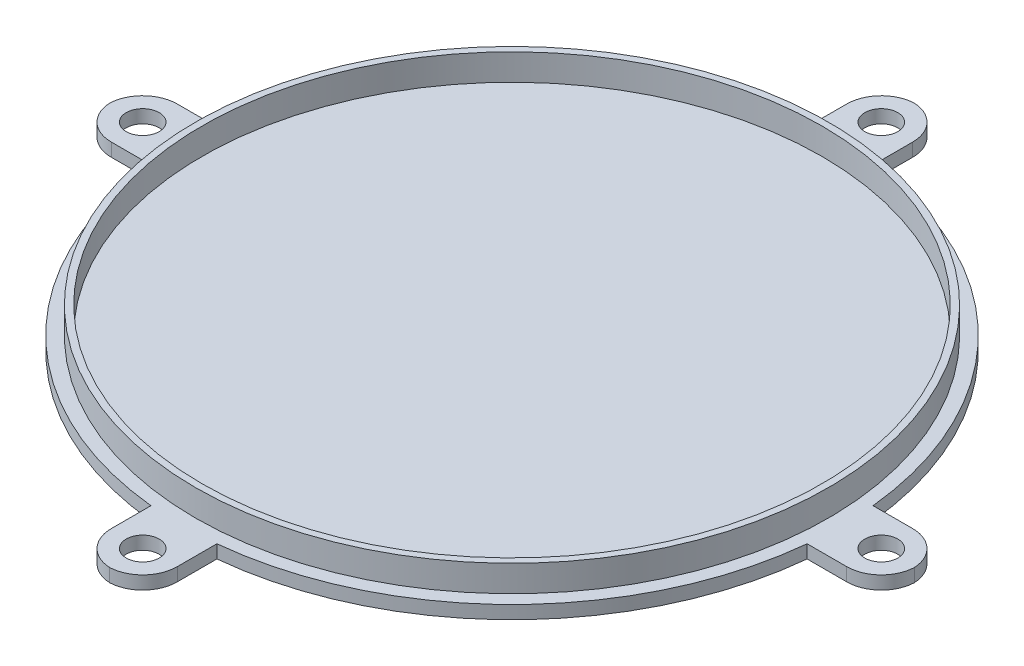
ISO-10303-21;
HEADER;
FILE_DESCRIPTION(('STEP AP214'),'2;1');
FILE_NAME('part.step','',(''),(''),'','','');
FILE_SCHEMA(('AUTOMOTIVE_DESIGN { 1 0 10303 214 1 1 1 1 }'));
ENDSEC;
DATA;
#1=APPLICATION_CONTEXT('core data for automotive mechanical design processes');
#2=APPLICATION_PROTOCOL_DEFINITION('international standard','automotive_design',2000,#1);
#3=PRODUCT_CONTEXT('',#1,'mechanical');
#4=PRODUCT('Part','Part','',(#3));
#5=PRODUCT_RELATED_PRODUCT_CATEGORY('part','',(#4));
#6=PRODUCT_DEFINITION_FORMATION('','',#4);
#7=PRODUCT_DEFINITION_CONTEXT('part definition',#1,'design');
#8=PRODUCT_DEFINITION('design','',#6,#7);
#9=PRODUCT_DEFINITION_SHAPE('','',#8);
#10=(LENGTH_UNIT() NAMED_UNIT(*) SI_UNIT(.MILLI.,.METRE.));
#11=(NAMED_UNIT(*) PLANE_ANGLE_UNIT() SI_UNIT($,.RADIAN.));
#12=(NAMED_UNIT(*) SI_UNIT($,.STERADIAN.) SOLID_ANGLE_UNIT());
#13=UNCERTAINTY_MEASURE_WITH_UNIT(LENGTH_MEASURE(1.E-05),#10,'distance_accuracy_value','');
#14=(GEOMETRIC_REPRESENTATION_CONTEXT(3) GLOBAL_UNCERTAINTY_ASSIGNED_CONTEXT((#13)) GLOBAL_UNIT_ASSIGNED_CONTEXT((#10,
#11,#12)) REPRESENTATION_CONTEXT('',''));
#15=CARTESIAN_POINT('',(0.,0.,0.));
#16=DIRECTION('',(0.,0.,1.));
#17=DIRECTION('',(1.,0.,0.));
#18=AXIS2_PLACEMENT_3D('',#15,#16,#17);
#19=CARTESIAN_POINT('',(0.,2.,0.));
#20=DIRECTION('',(0.,-1.,0.));
#21=DIRECTION('',(0.,0.,-1.));
#22=AXIS2_PLACEMENT_3D('',#19,#20,#21);
#23=CYLINDRICAL_SURFACE('',#22,50.);
#24=CARTESIAN_POINT('',(0.,0.,0.));
#25=DIRECTION('',(0.,1.,0.));
#26=DIRECTION('',(0.,0.,1.));
#27=AXIS2_PLACEMENT_3D('',#24,#25,#26);
#28=CIRCLE('',#27,50.);
#29=CARTESIAN_POINT('',(-49.749371855331,0.,4.99999999999999));
#30=VERTEX_POINT('',#29);
#31=CARTESIAN_POINT('',(-5.00000000000052,0.,49.749371855331));
#32=VERTEX_POINT('',#31);
#33=EDGE_CURVE('E357',#30,#32,#28,.T.);
#34=ORIENTED_EDGE('',*,*,#33,.T.);
#35=DIRECTION('',(0.,1.,0.));
#36=VECTOR('',#35,1.);
#37=CARTESIAN_POINT('',(-5.00000000000052,0.,49.749371855331));
#38=LINE('',#37,#36);
#39=CARTESIAN_POINT('',(-5.00000000000052,2.,49.749371855331));
#40=VERTEX_POINT('',#39);
#41=EDGE_CURVE('E60',#32,#40,#38,.T.);
#42=ORIENTED_EDGE('',*,*,#41,.T.);
#43=CARTESIAN_POINT('',(0.,2.,0.));
#44=DIRECTION('',(0.,1.,0.));
#45=DIRECTION('',(0.,0.,1.));
#46=AXIS2_PLACEMENT_3D('',#43,#44,#45);
#47=CIRCLE('',#46,50.);
#48=CARTESIAN_POINT('',(-49.749371855331,2.,5.));
#49=VERTEX_POINT('',#48);
#50=EDGE_CURVE('E45',#49,#40,#47,.T.);
#51=ORIENTED_EDGE('',*,*,#50,.F.);
#52=DIRECTION('',(0.,1.,0.));
#53=VECTOR('',#52,1.);
#54=CARTESIAN_POINT('',(-49.749371855331,0.,4.99999999999999));
#55=LINE('',#54,#53);
#56=EDGE_CURVE('E343',#30,#49,#55,.T.);
#57=ORIENTED_EDGE('',*,*,#56,.F.);
#58=EDGE_LOOP('',(#34,#42,#51,#57));
#59=FACE_BOUND('',#58,.T.);
#60=ADVANCED_FACE('F37',(#59),#23,.T.);
#61=CARTESIAN_POINT('',(4.99999999999948,2.,49.7493718553311));
#62=VERTEX_POINT('',#61);
#63=CARTESIAN_POINT('',(49.749371855331,2.,5.00000000000035));
#64=VERTEX_POINT('',#63);
#65=EDGE_CURVE('E52',#62,#64,#47,.T.);
#66=ORIENTED_EDGE('',*,*,#65,.F.);
#67=DIRECTION('',(0.,1.,0.));
#68=VECTOR('',#67,1.);
#69=CARTESIAN_POINT('',(4.99999999999947,0.,49.7493718553311));
#70=LINE('',#69,#68);
#71=CARTESIAN_POINT('',(4.99999999999947,0.,49.7493718553311));
#72=VERTEX_POINT('',#71);
#73=EDGE_CURVE('E402',#72,#62,#70,.T.);
#74=ORIENTED_EDGE('',*,*,#73,.F.);
#75=CARTESIAN_POINT('',(49.749371855331,0.,5.00000000000035));
#76=VERTEX_POINT('',#75);
#77=EDGE_CURVE('E358',#72,#76,#28,.T.);
#78=ORIENTED_EDGE('',*,*,#77,.T.);
#79=DIRECTION('',(0.,1.,0.));
#80=VECTOR('',#79,1.);
#81=CARTESIAN_POINT('',(49.749371855331,0.,5.00000000000035));
#82=LINE('',#81,#80);
#83=EDGE_CURVE('E228',#76,#64,#82,.T.);
#84=ORIENTED_EDGE('',*,*,#83,.T.);
#85=EDGE_LOOP('',(#66,#74,#78,#84));
#86=FACE_BOUND('',#85,.T.);
#87=ADVANCED_FACE('F388',(#86),#23,.T.);
#88=CARTESIAN_POINT('',(49.749371855331,2.,-4.99999999999965));
#89=VERTEX_POINT('',#88);
#90=CARTESIAN_POINT('',(5.00000000000017,2.,-49.749371855331));
#91=VERTEX_POINT('',#90);
#92=EDGE_CURVE('E360',#89,#91,#47,.T.);
#93=ORIENTED_EDGE('',*,*,#92,.F.);
#94=DIRECTION('',(0.,1.,0.));
#95=VECTOR('',#94,1.);
#96=CARTESIAN_POINT('',(49.7493718553311,0.,-4.99999999999966));
#97=LINE('',#96,#95);
#98=CARTESIAN_POINT('',(49.7493718553311,0.,-4.99999999999966));
#99=VERTEX_POINT('',#98);
#100=EDGE_CURVE('E225',#99,#89,#97,.T.);
#101=ORIENTED_EDGE('',*,*,#100,.F.);
#102=CARTESIAN_POINT('',(5.00000000000017,0.,-49.749371855331));
#103=VERTEX_POINT('',#102);
#104=EDGE_CURVE('E361',#99,#103,#28,.T.);
#105=ORIENTED_EDGE('',*,*,#104,.T.);
#106=DIRECTION('',(0.,1.,0.));
#107=VECTOR('',#106,1.);
#108=CARTESIAN_POINT('',(5.00000000000017,0.,-49.749371855331));
#109=LINE('',#108,#107);
#110=EDGE_CURVE('E269',#103,#91,#109,.T.);
#111=ORIENTED_EDGE('',*,*,#110,.T.);
#112=EDGE_LOOP('',(#93,#101,#105,#111));
#113=FACE_BOUND('',#112,.T.);
#114=ADVANCED_FACE('F368',(#113),#23,.T.);
#115=CARTESIAN_POINT('',(-4.99999999999983,2.,-49.749371855331));
#116=VERTEX_POINT('',#115);
#117=CARTESIAN_POINT('',(-49.749371855331,2.,-5.));
#118=VERTEX_POINT('',#117);
#119=EDGE_CURVE('E356',#116,#118,#47,.T.);
#120=ORIENTED_EDGE('',*,*,#119,.F.);
#121=DIRECTION('',(0.,1.,0.));
#122=VECTOR('',#121,1.);
#123=CARTESIAN_POINT('',(-4.99999999999982,0.,-49.749371855331));
#124=LINE('',#123,#122);
#125=CARTESIAN_POINT('',(-4.99999999999982,0.,-49.749371855331));
#126=VERTEX_POINT('',#125);
#127=EDGE_CURVE('E266',#126,#116,#124,.T.);
#128=ORIENTED_EDGE('',*,*,#127,.F.);
#129=CARTESIAN_POINT('',(-49.749371855331,0.,-5.));
#130=VERTEX_POINT('',#129);
#131=EDGE_CURVE('E353',#126,#130,#28,.T.);
#132=ORIENTED_EDGE('',*,*,#131,.T.);
#133=DIRECTION('',(0.,1.,0.));
#134=VECTOR('',#133,1.);
#135=CARTESIAN_POINT('',(-49.749371855331,0.,-5.));
#136=LINE('',#135,#134);
#137=EDGE_CURVE('E340',#130,#118,#136,.T.);
#138=ORIENTED_EDGE('',*,*,#137,.T.);
#139=EDGE_LOOP('',(#120,#128,#132,#138));
#140=FACE_BOUND('',#139,.T.);
#141=ADVANCED_FACE('F39',(#140),#23,.T.);
#142=CARTESIAN_POINT('',(0.,2.,0.));
#143=DIRECTION('',(0.,1.,0.));
#144=DIRECTION('',(0.,0.,1.));
#145=AXIS2_PLACEMENT_3D('',#142,#143,#144);
#146=PLANE('',#145);
#147=CARTESIAN_POINT('',(0.,2.,0.));
#148=DIRECTION('',(0.,1.,0.));
#149=DIRECTION('',(0.,0.,1.));
#150=AXIS2_PLACEMENT_3D('',#147,#148,#149);
#151=CIRCLE('',#150,48.);
#152=CARTESIAN_POINT('',(0.,2.,48.));
#153=VERTEX_POINT('',#152);
#154=EDGE_CURVE('E349',#153,#153,#151,.T.);
#155=ORIENTED_EDGE('',*,*,#154,.F.);
#156=EDGE_LOOP('',(#155));
#157=FACE_BOUND('',#156,.T.);
#158=ORIENTED_EDGE('',*,*,#50,.T.);
#159=DIRECTION('',(0.,0.,1.));
#160=VECTOR('',#159,1.);
#161=CARTESIAN_POINT('',(-5.00000000000058,2.,55.759371855331));
#162=LINE('',#161,#160);
#163=CARTESIAN_POINT('',(-5.00000000000058,2.,55.759371855331));
#164=VERTEX_POINT('',#163);
#165=EDGE_CURVE('E201',#40,#164,#162,.T.);
#166=ORIENTED_EDGE('',*,*,#165,.T.);
#167=CARTESIAN_POINT('',(0.246418335069104,2.,55.759371855331));
#168=DIRECTION('',(0.,1.,0.));
#169=DIRECTION('',(0.,0.,1.));
#170=AXIS2_PLACEMENT_3D('',#167,#168,#169);
#171=CIRCLE('',#170,5.24641833506969);
#172=CARTESIAN_POINT('',(-6.37077196552482E-13,2.,61.));
#173=VERTEX_POINT('',#172);
#174=EDGE_CURVE('E179',#164,#173,#171,.T.);
#175=ORIENTED_EDGE('',*,*,#174,.T.);
#176=CARTESIAN_POINT('',(-0.246418335070271,2.,55.759371855331));
#177=DIRECTION('',(0.,1.,0.));
#178=DIRECTION('',(0.,0.,-1.));
#179=AXIS2_PLACEMENT_3D('',#176,#177,#178);
#180=CIRCLE('',#179,5.24641833506969);
#181=CARTESIAN_POINT('',(4.99999999999942,2.,55.7593718553311));
#182=VERTEX_POINT('',#181);
#183=EDGE_CURVE('E188',#173,#182,#180,.T.);
#184=ORIENTED_EDGE('',*,*,#183,.T.);
#185=DIRECTION('',(0.,0.,-1.));
#186=VECTOR('',#185,1.);
#187=CARTESIAN_POINT('',(4.99999999999942,2.,55.7593718553311));
#188=LINE('',#187,#186);
#189=EDGE_CURVE('E195',#182,#62,#188,.T.);
#190=ORIENTED_EDGE('',*,*,#189,.T.);
#191=ORIENTED_EDGE('',*,*,#65,.T.);
#192=DIRECTION('',(1.,0.,0.));
#193=VECTOR('',#192,1.);
#194=CARTESIAN_POINT('',(55.759371855331,2.,5.00000000000039));
#195=LINE('',#194,#193);
#196=CARTESIAN_POINT('',(55.759371855331,2.,5.00000000000039));
#197=VERTEX_POINT('',#196);
#198=EDGE_CURVE('E236',#64,#197,#195,.T.);
#199=ORIENTED_EDGE('',*,*,#198,.T.);
#200=CARTESIAN_POINT('',(55.759371855331,2.,-0.246418335069297));
#201=DIRECTION('',(0.,1.,0.));
#202=DIRECTION('',(0.,0.,1.));
#203=AXIS2_PLACEMENT_3D('',#200,#201,#202);
#204=CIRCLE('',#203,5.24641833506969);
#205=CARTESIAN_POINT('',(61.,2.,4.29181429978387E-13));
#206=VERTEX_POINT('',#205);
#207=EDGE_CURVE('E233',#197,#206,#204,.T.);
#208=ORIENTED_EDGE('',*,*,#207,.T.);
#209=CARTESIAN_POINT('',(55.759371855331,2.,0.246418335070078));
#210=DIRECTION('',(0.,1.,0.));
#211=DIRECTION('',(0.,0.,-1.));
#212=AXIS2_PLACEMENT_3D('',#209,#210,#211);
#213=CIRCLE('',#212,5.24641833506968);
#214=CARTESIAN_POINT('',(55.7593718553311,2.,-4.99999999999961));
#215=VERTEX_POINT('',#214);
#216=EDGE_CURVE('E243',#206,#215,#213,.T.);
#217=ORIENTED_EDGE('',*,*,#216,.T.);
#218=DIRECTION('',(-1.,0.,0.));
#219=VECTOR('',#218,1.);
#220=CARTESIAN_POINT('',(55.7593718553311,2.,-4.99999999999961));
#221=LINE('',#220,#219);
#222=EDGE_CURVE('E240',#215,#89,#221,.T.);
#223=ORIENTED_EDGE('',*,*,#222,.T.);
#224=ORIENTED_EDGE('',*,*,#92,.T.);
#225=DIRECTION('',(0.,0.,-1.));
#226=VECTOR('',#225,1.);
#227=CARTESIAN_POINT('',(5.0000000000002,2.,-55.759371855331));
#228=LINE('',#227,#226);
#229=CARTESIAN_POINT('',(5.00000000000019,2.,-55.759371855331));
#230=VERTEX_POINT('',#229);
#231=EDGE_CURVE('E278',#91,#230,#228,.T.);
#232=ORIENTED_EDGE('',*,*,#231,.T.);
#233=CARTESIAN_POINT('',(-0.246418335069493,2.,-55.759371855331));
#234=DIRECTION('',(0.,1.,0.));
#235=DIRECTION('',(0.,0.,1.));
#236=AXIS2_PLACEMENT_3D('',#233,#234,#235);
#237=CIRCLE('',#236,5.24641833506969);
#238=CARTESIAN_POINT('',(2.12069944938165E-13,2.,-61.));
#239=VERTEX_POINT('',#238);
#240=EDGE_CURVE('E275',#230,#239,#237,.T.);
#241=ORIENTED_EDGE('',*,*,#240,.T.);
#242=CARTESIAN_POINT('',(0.246418335069881,2.,-55.759371855331));
#243=DIRECTION('',(0.,1.,0.));
#244=DIRECTION('',(0.,0.,-1.));
#245=AXIS2_PLACEMENT_3D('',#242,#243,#244);
#246=CIRCLE('',#245,5.24641833506969);
#247=CARTESIAN_POINT('',(-4.99999999999981,2.,-55.759371855331));
#248=VERTEX_POINT('',#247);
#249=EDGE_CURVE('E285',#239,#248,#246,.T.);
#250=ORIENTED_EDGE('',*,*,#249,.T.);
#251=DIRECTION('',(0.,0.,1.));
#252=VECTOR('',#251,1.);
#253=CARTESIAN_POINT('',(-4.99999999999981,2.,-55.759371855331));
#254=LINE('',#253,#252);
#255=EDGE_CURVE('E282',#248,#116,#254,.T.);
#256=ORIENTED_EDGE('',*,*,#255,.T.);
#257=ORIENTED_EDGE('',*,*,#119,.T.);
#258=DIRECTION('',(-1.,0.,0.));
#259=VECTOR('',#258,1.);
#260=CARTESIAN_POINT('',(-55.759371855331,2.,-5.));
#261=LINE('',#260,#259);
#262=CARTESIAN_POINT('',(-55.759371855331,2.,-5.));
#263=VERTEX_POINT('',#262);
#264=EDGE_CURVE('E330',#118,#263,#261,.T.);
#265=ORIENTED_EDGE('',*,*,#264,.T.);
#266=CARTESIAN_POINT('',(-55.759371855331,2.,0.246418335069688));
#267=DIRECTION('',(0.,1.,0.));
#268=DIRECTION('',(0.,0.,1.));
#269=AXIS2_PLACEMENT_3D('',#266,#267,#268);
#270=CIRCLE('',#269,5.24641833506969);
#271=CARTESIAN_POINT('',(-61.,2.,0.));
#272=VERTEX_POINT('',#271);
#273=EDGE_CURVE('E315',#263,#272,#270,.T.);
#274=ORIENTED_EDGE('',*,*,#273,.T.);
#275=CARTESIAN_POINT('',(-55.759371855331,2.,-0.246418335069687));
#276=DIRECTION('',(0.,1.,0.));
#277=DIRECTION('',(0.,0.,-1.));
#278=AXIS2_PLACEMENT_3D('',#275,#276,#277);
#279=CIRCLE('',#278,5.24641833506969);
#280=CARTESIAN_POINT('',(-55.759371855331,2.,5.));
#281=VERTEX_POINT('',#280);
#282=EDGE_CURVE('E308',#272,#281,#279,.T.);
#283=ORIENTED_EDGE('',*,*,#282,.T.);
#284=DIRECTION('',(1.,0.,0.));
#285=VECTOR('',#284,1.);
#286=CARTESIAN_POINT('',(-55.759371855331,2.,5.));
#287=LINE('',#286,#285);
#288=EDGE_CURVE('E327',#281,#49,#287,.T.);
#289=ORIENTED_EDGE('',*,*,#288,.T.);
#290=EDGE_LOOP('',(#158,#166,#175,#184,#190,#191,#199,#208,#217,#223,#224,#232,#241,#250,#256,
#257,#265,#274,#283,#289));
#291=FACE_BOUND('',#290,.T.);
#292=CARTESIAN_POINT('',(-56.,2.,0.));
#293=DIRECTION('',(0.,1.,0.));
#294=DIRECTION('',(0.,0.,1.));
#295=AXIS2_PLACEMENT_3D('',#292,#293,#294);
#296=CIRCLE('',#295,2.5);
#297=CARTESIAN_POINT('',(-56.,2.,2.5));
#298=VERTEX_POINT('',#297);
#299=EDGE_CURVE('E302',#298,#298,#296,.T.);
#300=ORIENTED_EDGE('',*,*,#299,.F.);
#301=EDGE_LOOP('',(#300));
#302=FACE_BOUND('',#301,.T.);
#303=CARTESIAN_POINT('',(1.94788166895727E-13,2.,-56.));
#304=DIRECTION('',(0.,1.,0.));
#305=DIRECTION('',(0.,0.,1.));
#306=AXIS2_PLACEMENT_3D('',#303,#304,#305);
#307=CIRCLE('',#306,2.5);
#308=CARTESIAN_POINT('',(1.94788166895727E-13,2.,-53.5));
#309=VERTEX_POINT('',#308);
#310=EDGE_CURVE('E299',#309,#309,#307,.T.);
#311=ORIENTED_EDGE('',*,*,#310,.F.);
#312=EDGE_LOOP('',(#311));
#313=FACE_BOUND('',#312,.T.);
#314=CARTESIAN_POINT('',(56.,2.,3.9204584534692E-13));
#315=DIRECTION('',(0.,1.,0.));
#316=DIRECTION('',(0.,0.,1.));
#317=AXIS2_PLACEMENT_3D('',#314,#315,#316);
#318=CIRCLE('',#317,2.5);
#319=CARTESIAN_POINT('',(56.,2.,2.5000000000004));
#320=VERTEX_POINT('',#319);
#321=EDGE_CURVE('E257',#320,#320,#318,.T.);
#322=ORIENTED_EDGE('',*,*,#321,.F.);
#323=EDGE_LOOP('',(#322));
#324=FACE_BOUND('',#323,.T.);
#325=CARTESIAN_POINT('',(-5.85834076846158E-13,2.,56.));
#326=DIRECTION('',(0.,1.,0.));
#327=DIRECTION('',(0.,0.,1.));
#328=AXIS2_PLACEMENT_3D('',#325,#326,#327);
#329=CIRCLE('',#328,2.5);
#330=CARTESIAN_POINT('',(-5.85834076846158E-13,2.,58.5));
#331=VERTEX_POINT('',#330);
#332=EDGE_CURVE('E216',#331,#331,#329,.T.);
#333=ORIENTED_EDGE('',*,*,#332,.F.);
#334=EDGE_LOOP('',(#333));
#335=FACE_BOUND('',#334,.T.);
#336=ADVANCED_FACE('F198',(#157,#291,#302,#313,#324,#335),#146,.T.);
#337=CARTESIAN_POINT('',(0.,0.,0.));
#338=DIRECTION('',(0.,1.,0.));
#339=DIRECTION('',(0.,0.,1.));
#340=AXIS2_PLACEMENT_3D('',#337,#338,#339);
#341=PLANE('',#340);
#342=ORIENTED_EDGE('',*,*,#33,.F.);
#343=DIRECTION('',(1.,0.,0.));
#344=VECTOR('',#343,1.);
#345=CARTESIAN_POINT('',(-55.759371855331,0.,5.));
#346=LINE('',#345,#344);
#347=CARTESIAN_POINT('',(-55.759371855331,0.,5.));
#348=VERTEX_POINT('',#347);
#349=EDGE_CURVE('E314',#348,#30,#346,.T.);
#350=ORIENTED_EDGE('',*,*,#349,.F.);
#351=CARTESIAN_POINT('',(-55.759371855331,0.,-0.246418335069687));
#352=DIRECTION('',(0.,1.,0.));
#353=DIRECTION('',(0.,0.,-1.));
#354=AXIS2_PLACEMENT_3D('',#351,#352,#353);
#355=CIRCLE('',#354,5.24641833506969);
#356=CARTESIAN_POINT('',(-61.,0.,0.));
#357=VERTEX_POINT('',#356);
#358=EDGE_CURVE('E311',#357,#348,#355,.T.);
#359=ORIENTED_EDGE('',*,*,#358,.F.);
#360=CARTESIAN_POINT('',(-55.759371855331,0.,0.246418335069688));
#361=DIRECTION('',(0.,1.,0.));
#362=DIRECTION('',(0.,0.,1.));
#363=AXIS2_PLACEMENT_3D('',#360,#361,#362);
#364=CIRCLE('',#363,5.24641833506969);
#365=CARTESIAN_POINT('',(-55.759371855331,0.,-5.));
#366=VERTEX_POINT('',#365);
#367=EDGE_CURVE('E321',#366,#357,#364,.T.);
#368=ORIENTED_EDGE('',*,*,#367,.F.);
#369=DIRECTION('',(-1.,0.,0.));
#370=VECTOR('',#369,1.);
#371=CARTESIAN_POINT('',(-55.759371855331,0.,-5.));
#372=LINE('',#371,#370);
#373=EDGE_CURVE('E318',#130,#366,#372,.T.);
#374=ORIENTED_EDGE('',*,*,#373,.F.);
#375=ORIENTED_EDGE('',*,*,#131,.F.);
#376=DIRECTION('',(0.,0.,1.));
#377=VECTOR('',#376,1.);
#378=CARTESIAN_POINT('',(-4.99999999999981,0.,-55.759371855331));
#379=LINE('',#378,#377);
#380=CARTESIAN_POINT('',(-4.99999999999981,0.,-55.759371855331));
#381=VERTEX_POINT('',#380);
#382=EDGE_CURVE('E294',#381,#126,#379,.T.);
#383=ORIENTED_EDGE('',*,*,#382,.F.);
#384=CARTESIAN_POINT('',(0.246418335069881,0.,-55.759371855331));
#385=DIRECTION('',(0.,1.,0.));
#386=DIRECTION('',(0.,0.,-1.));
#387=AXIS2_PLACEMENT_3D('',#384,#385,#386);
#388=CIRCLE('',#387,5.24641833506969);
#389=CARTESIAN_POINT('',(2.12069944938165E-13,0.,-61.));
#390=VERTEX_POINT('',#389);
#391=EDGE_CURVE('E279',#390,#381,#388,.T.);
#392=ORIENTED_EDGE('',*,*,#391,.F.);
#393=CARTESIAN_POINT('',(-0.246418335069493,0.,-55.759371855331));
#394=DIRECTION('',(0.,1.,0.));
#395=DIRECTION('',(0.,0.,1.));
#396=AXIS2_PLACEMENT_3D('',#393,#394,#395);
#397=CIRCLE('',#396,5.24641833506969);
#398=CARTESIAN_POINT('',(5.00000000000019,0.,-55.759371855331));
#399=VERTEX_POINT('',#398);
#400=EDGE_CURVE('E265',#399,#390,#397,.T.);
#401=ORIENTED_EDGE('',*,*,#400,.F.);
#402=DIRECTION('',(0.,0.,-1.));
#403=VECTOR('',#402,1.);
#404=CARTESIAN_POINT('',(5.0000000000002,0.,-55.759371855331));
#405=LINE('',#404,#403);
#406=EDGE_CURVE('E291',#103,#399,#405,.T.);
#407=ORIENTED_EDGE('',*,*,#406,.F.);
#408=ORIENTED_EDGE('',*,*,#104,.F.);
#409=DIRECTION('',(-1.,0.,0.));
#410=VECTOR('',#409,1.);
#411=CARTESIAN_POINT('',(55.7593718553311,0.,-4.99999999999961));
#412=LINE('',#411,#410);
#413=CARTESIAN_POINT('',(55.7593718553311,0.,-4.99999999999961));
#414=VERTEX_POINT('',#413);
#415=EDGE_CURVE('E252',#414,#99,#412,.T.);
#416=ORIENTED_EDGE('',*,*,#415,.F.);
#417=CARTESIAN_POINT('',(55.759371855331,0.,0.246418335070078));
#418=DIRECTION('',(0.,1.,0.));
#419=DIRECTION('',(0.,0.,-1.));
#420=AXIS2_PLACEMENT_3D('',#417,#418,#419);
#421=CIRCLE('',#420,5.24641833506968);
#422=CARTESIAN_POINT('',(61.,0.,4.29181429978387E-13));
#423=VERTEX_POINT('',#422);
#424=EDGE_CURVE('E237',#423,#414,#421,.T.);
#425=ORIENTED_EDGE('',*,*,#424,.F.);
#426=CARTESIAN_POINT('',(55.759371855331,0.,-0.246418335069297));
#427=DIRECTION('',(0.,1.,0.));
#428=DIRECTION('',(0.,0.,1.));
#429=AXIS2_PLACEMENT_3D('',#426,#427,#428);
#430=CIRCLE('',#429,5.24641833506969);
#431=CARTESIAN_POINT('',(55.759371855331,0.,5.00000000000039));
#432=VERTEX_POINT('',#431);
#433=EDGE_CURVE('E224',#432,#423,#430,.T.);
#434=ORIENTED_EDGE('',*,*,#433,.F.);
#435=DIRECTION('',(1.,0.,0.));
#436=VECTOR('',#435,1.);
#437=CARTESIAN_POINT('',(55.759371855331,0.,5.00000000000039));
#438=LINE('',#437,#436);
#439=EDGE_CURVE('E249',#76,#432,#438,.T.);
#440=ORIENTED_EDGE('',*,*,#439,.F.);
#441=ORIENTED_EDGE('',*,*,#77,.F.);
#442=DIRECTION('',(0.,0.,-1.));
#443=VECTOR('',#442,1.);
#444=CARTESIAN_POINT('',(4.99999999999942,0.,55.7593718553311));
#445=LINE('',#444,#443);
#446=CARTESIAN_POINT('',(4.99999999999942,0.,55.7593718553311));
#447=VERTEX_POINT('',#446);
#448=EDGE_CURVE('E205',#447,#72,#445,.T.);
#449=ORIENTED_EDGE('',*,*,#448,.F.);
#450=CARTESIAN_POINT('',(-0.246418335070271,0.,55.759371855331));
#451=DIRECTION('',(0.,1.,0.));
#452=DIRECTION('',(0.,0.,-1.));
#453=AXIS2_PLACEMENT_3D('',#450,#451,#452);
#454=CIRCLE('',#453,5.24641833506969);
#455=CARTESIAN_POINT('',(-6.37077196552482E-13,0.,61.));
#456=VERTEX_POINT('',#455);
#457=EDGE_CURVE('E202',#456,#447,#454,.T.);
#458=ORIENTED_EDGE('',*,*,#457,.F.);
#459=CARTESIAN_POINT('',(0.246418335069104,0.,55.759371855331));
#460=DIRECTION('',(0.,1.,0.));
#461=DIRECTION('',(0.,0.,1.));
#462=AXIS2_PLACEMENT_3D('',#459,#460,#461);
#463=CIRCLE('',#462,5.24641833506969);
#464=CARTESIAN_POINT('',(-5.00000000000058,0.,55.759371855331));
#465=VERTEX_POINT('',#464);
#466=EDGE_CURVE('E181',#465,#456,#463,.T.);
#467=ORIENTED_EDGE('',*,*,#466,.F.);
#468=DIRECTION('',(0.,0.,1.));
#469=VECTOR('',#468,1.);
#470=CARTESIAN_POINT('',(-5.00000000000058,0.,55.759371855331));
#471=LINE('',#470,#469);
#472=EDGE_CURVE('E211',#32,#465,#471,.T.);
#473=ORIENTED_EDGE('',*,*,#472,.F.);
#474=EDGE_LOOP('',(#342,#350,#359,#368,#374,#375,#383,#392,#401,#407,#408,#416,#425,#434,#440,
#441,#449,#458,#467,#473));
#475=FACE_BOUND('',#474,.T.);
#476=CARTESIAN_POINT('',(-56.,0.,0.));
#477=DIRECTION('',(0.,1.,0.));
#478=DIRECTION('',(0.,0.,1.));
#479=AXIS2_PLACEMENT_3D('',#476,#477,#478);
#480=CIRCLE('',#479,2.5);
#481=CARTESIAN_POINT('',(-56.,0.,2.5));
#482=VERTEX_POINT('',#481);
#483=EDGE_CURVE('E305',#482,#482,#480,.T.);
#484=ORIENTED_EDGE('',*,*,#483,.T.);
#485=EDGE_LOOP('',(#484));
#486=FACE_BOUND('',#485,.T.);
#487=CARTESIAN_POINT('',(1.94788166895727E-13,0.,-56.));
#488=DIRECTION('',(0.,1.,0.));
#489=DIRECTION('',(0.,0.,1.));
#490=AXIS2_PLACEMENT_3D('',#487,#488,#489);
#491=CIRCLE('',#490,2.5);
#492=CARTESIAN_POINT('',(1.94788166895727E-13,0.,-53.5));
#493=VERTEX_POINT('',#492);
#494=EDGE_CURVE('E288',#493,#493,#491,.T.);
#495=ORIENTED_EDGE('',*,*,#494,.T.);
#496=EDGE_LOOP('',(#495));
#497=FACE_BOUND('',#496,.T.);
#498=CARTESIAN_POINT('',(56.,0.,3.9204584534692E-13));
#499=DIRECTION('',(0.,1.,0.));
#500=DIRECTION('',(0.,0.,1.));
#501=AXIS2_PLACEMENT_3D('',#498,#499,#500);
#502=CIRCLE('',#501,2.5);
#503=CARTESIAN_POINT('',(56.,0.,2.5000000000004));
#504=VERTEX_POINT('',#503);
#505=EDGE_CURVE('E246',#504,#504,#502,.T.);
#506=ORIENTED_EDGE('',*,*,#505,.T.);
#507=EDGE_LOOP('',(#506));
#508=FACE_BOUND('',#507,.T.);
#509=CARTESIAN_POINT('',(-5.85834076846158E-13,0.,56.));
#510=DIRECTION('',(0.,1.,0.));
#511=DIRECTION('',(0.,0.,1.));
#512=AXIS2_PLACEMENT_3D('',#509,#510,#511);
#513=CIRCLE('',#512,2.5);
#514=CARTESIAN_POINT('',(-5.85834076846158E-13,0.,58.5));
#515=VERTEX_POINT('',#514);
#516=EDGE_CURVE('E194',#515,#515,#513,.T.);
#517=ORIENTED_EDGE('',*,*,#516,.T.);
#518=EDGE_LOOP('',(#517));
#519=FACE_BOUND('',#518,.T.);
#520=ADVANCED_FACE('F376',(#475,#486,#497,#508,#519),#341,.F.);
#521=CARTESIAN_POINT('',(0.,6.,0.));
#522=DIRECTION('',(0.,1.,0.));
#523=DIRECTION('',(0.,0.,1.));
#524=AXIS2_PLACEMENT_3D('',#521,#522,#523);
#525=PLANE('',#524);
#526=CARTESIAN_POINT('',(0.,6.,0.));
#527=DIRECTION('',(0.,1.,0.));
#528=DIRECTION('',(0.,0.,1.));
#529=AXIS2_PLACEMENT_3D('',#526,#527,#528);
#530=CIRCLE('',#529,48.);
#531=CARTESIAN_POINT('',(0.,6.,48.));
#532=VERTEX_POINT('',#531);
#533=EDGE_CURVE('E350',#532,#532,#530,.T.);
#534=ORIENTED_EDGE('',*,*,#533,.T.);
#535=EDGE_LOOP('',(#534));
#536=FACE_BOUND('',#535,.T.);
#537=CARTESIAN_POINT('',(0.,6.,0.));
#538=DIRECTION('',(0.,1.,0.));
#539=DIRECTION('',(0.,0.,1.));
#540=AXIS2_PLACEMENT_3D('',#537,#538,#539);
#541=CIRCLE('',#540,47.);
#542=CARTESIAN_POINT('',(0.,6.,47.));
#543=VERTEX_POINT('',#542);
#544=EDGE_CURVE('E337',#543,#543,#541,.T.);
#545=ORIENTED_EDGE('',*,*,#544,.F.);
#546=EDGE_LOOP('',(#545));
#547=FACE_BOUND('',#546,.T.);
#548=ADVANCED_FACE('F501',(#536,#547),#525,.T.);
#549=CARTESIAN_POINT('',(0.,6.,0.));
#550=DIRECTION('',(0.,-1.,0.));
#551=DIRECTION('',(0.,0.,-1.));
#552=AXIS2_PLACEMENT_3D('',#549,#550,#551);
#553=CYLINDRICAL_SURFACE('',#552,48.);
#554=ORIENTED_EDGE('',*,*,#533,.F.);
#555=EDGE_LOOP('',(#554));
#556=FACE_BOUND('',#555,.T.);
#557=ORIENTED_EDGE('',*,*,#154,.T.);
#558=EDGE_LOOP('',(#557));
#559=FACE_BOUND('',#558,.T.);
#560=ADVANCED_FACE('F490',(#556,#559),#553,.T.);
#561=CARTESIAN_POINT('',(0.,6.,0.));
#562=DIRECTION('',(0.,-1.,0.));
#563=DIRECTION('',(0.,0.,-1.));
#564=AXIS2_PLACEMENT_3D('',#561,#562,#563);
#565=CYLINDRICAL_SURFACE('',#564,47.);
#566=ORIENTED_EDGE('',*,*,#544,.T.);
#567=EDGE_LOOP('',(#566));
#568=FACE_BOUND('',#567,.T.);
#569=CARTESIAN_POINT('',(0.,2.,0.));
#570=DIRECTION('',(0.,1.,0.));
#571=DIRECTION('',(0.,0.,1.));
#572=AXIS2_PLACEMENT_3D('',#569,#570,#571);
#573=CIRCLE('',#572,47.);
#574=CARTESIAN_POINT('',(0.,2.,47.));
#575=VERTEX_POINT('',#574);
#576=EDGE_CURVE('E11',#575,#575,#573,.F.);
#577=ORIENTED_EDGE('',*,*,#576,.T.);
#578=EDGE_LOOP('',(#577));
#579=FACE_BOUND('',#578,.T.);
#580=ADVANCED_FACE('F478',(#568,#579),#565,.F.);
#581=ORIENTED_EDGE('',*,*,#576,.F.);
#582=EDGE_LOOP('',(#581));
#583=FACE_BOUND('',#582,.T.);
#584=ADVANCED_FACE('F455',(#583),#146,.T.);
#585=CARTESIAN_POINT('',(-55.759371855331,0.,-0.246418335069687));
#586=DIRECTION('',(0.,1.,0.));
#587=DIRECTION('',(0.,0.,1.));
#588=AXIS2_PLACEMENT_3D('',#585,#586,#587);
#589=CYLINDRICAL_SURFACE('',#588,5.24641833506969);
#590=ORIENTED_EDGE('',*,*,#282,.F.);
#591=DIRECTION('',(0.,1.,0.));
#592=VECTOR('',#591,1.);
#593=CARTESIAN_POINT('',(-61.,0.,0.));
#594=LINE('',#593,#592);
#595=EDGE_CURVE('E335',#357,#272,#594,.T.);
#596=ORIENTED_EDGE('',*,*,#595,.F.);
#597=ORIENTED_EDGE('',*,*,#358,.T.);
#598=DIRECTION('',(0.,1.,0.));
#599=VECTOR('',#598,1.);
#600=CARTESIAN_POINT('',(-55.759371855331,0.,5.));
#601=LINE('',#600,#599);
#602=EDGE_CURVE('E324',#348,#281,#601,.T.);
#603=ORIENTED_EDGE('',*,*,#602,.T.);
#604=EDGE_LOOP('',(#590,#596,#597,#603));
#605=FACE_BOUND('',#604,.T.);
#606=ADVANCED_FACE('F418',(#605),#589,.T.);
#607=CARTESIAN_POINT('',(-55.759371855331,0.,0.246418335069688));
#608=DIRECTION('',(0.,1.,0.));
#609=DIRECTION('',(0.,0.,1.));
#610=AXIS2_PLACEMENT_3D('',#607,#608,#609);
#611=CYLINDRICAL_SURFACE('',#610,5.24641833506969);
#612=ORIENTED_EDGE('',*,*,#273,.F.);
#613=DIRECTION('',(0.,1.,0.));
#614=VECTOR('',#613,1.);
#615=CARTESIAN_POINT('',(-55.759371855331,0.,-5.));
#616=LINE('',#615,#614);
#617=EDGE_CURVE('E338',#366,#263,#616,.T.);
#618=ORIENTED_EDGE('',*,*,#617,.F.);
#619=ORIENTED_EDGE('',*,*,#367,.T.);
#620=ORIENTED_EDGE('',*,*,#595,.T.);
#621=EDGE_LOOP('',(#612,#618,#619,#620));
#622=FACE_BOUND('',#621,.T.);
#623=ADVANCED_FACE('F423',(#622),#611,.T.);
#624=CARTESIAN_POINT('',(-55.759371855331,0.,-5.));
#625=DIRECTION('',(0.,0.,-1.));
#626=DIRECTION('',(-1.,0.,0.));
#627=AXIS2_PLACEMENT_3D('',#624,#625,#626);
#628=PLANE('',#627);
#629=ORIENTED_EDGE('',*,*,#264,.F.);
#630=ORIENTED_EDGE('',*,*,#137,.F.);
#631=ORIENTED_EDGE('',*,*,#373,.T.);
#632=ORIENTED_EDGE('',*,*,#617,.T.);
#633=EDGE_LOOP('',(#629,#630,#631,#632));
#634=FACE_BOUND('',#633,.T.);
#635=ADVANCED_FACE('F426',(#634),#628,.T.);
#636=CARTESIAN_POINT('',(-55.759371855331,0.,5.));
#637=DIRECTION('',(0.,0.,1.));
#638=DIRECTION('',(1.,0.,0.));
#639=AXIS2_PLACEMENT_3D('',#636,#637,#638);
#640=PLANE('',#639);
#641=ORIENTED_EDGE('',*,*,#288,.F.);
#642=ORIENTED_EDGE('',*,*,#602,.F.);
#643=ORIENTED_EDGE('',*,*,#349,.T.);
#644=ORIENTED_EDGE('',*,*,#56,.T.);
#645=EDGE_LOOP('',(#641,#642,#643,#644));
#646=FACE_BOUND('',#645,.T.);
#647=ADVANCED_FACE('F415',(#646),#640,.T.);
#648=CARTESIAN_POINT('',(-56.,0.,0.));
#649=DIRECTION('',(0.,1.,0.));
#650=DIRECTION('',(0.,0.,1.));
#651=AXIS2_PLACEMENT_3D('',#648,#649,#650);
#652=CYLINDRICAL_SURFACE('',#651,2.5);
#653=ORIENTED_EDGE('',*,*,#483,.F.);
#654=EDGE_LOOP('',(#653));
#655=FACE_BOUND('',#654,.T.);
#656=ORIENTED_EDGE('',*,*,#299,.T.);
#657=EDGE_LOOP('',(#656));
#658=FACE_BOUND('',#657,.T.);
#659=ADVANCED_FACE('F433',(#655,#658),#652,.F.);
#660=CARTESIAN_POINT('',(0.246418335069881,0.,-55.759371855331));
#661=DIRECTION('',(0.,1.,0.));
#662=DIRECTION('',(0.,0.,1.));
#663=AXIS2_PLACEMENT_3D('',#660,#661,#662);
#664=CYLINDRICAL_SURFACE('',#663,5.24641833506969);
#665=ORIENTED_EDGE('',*,*,#249,.F.);
#666=DIRECTION('',(0.,1.,0.));
#667=VECTOR('',#666,1.);
#668=CARTESIAN_POINT('',(2.12069944938165E-13,0.,-61.));
#669=LINE('',#668,#667);
#670=EDGE_CURVE('E260',#390,#239,#669,.T.);
#671=ORIENTED_EDGE('',*,*,#670,.F.);
#672=ORIENTED_EDGE('',*,*,#391,.T.);
#673=DIRECTION('',(0.,1.,0.));
#674=VECTOR('',#673,1.);
#675=CARTESIAN_POINT('',(-4.99999999999981,0.,-55.759371855331));
#676=LINE('',#675,#674);
#677=EDGE_CURVE('E263',#381,#248,#676,.T.);
#678=ORIENTED_EDGE('',*,*,#677,.T.);
#679=EDGE_LOOP('',(#665,#671,#672,#678));
#680=FACE_BOUND('',#679,.T.);
#681=ADVANCED_FACE('F431',(#680),#664,.T.);
#682=CARTESIAN_POINT('',(-0.246418335069493,0.,-55.759371855331));
#683=DIRECTION('',(0.,1.,0.));
#684=DIRECTION('',(0.,0.,1.));
#685=AXIS2_PLACEMENT_3D('',#682,#683,#684);
#686=CYLINDRICAL_SURFACE('',#685,5.24641833506969);
#687=ORIENTED_EDGE('',*,*,#240,.F.);
#688=DIRECTION('',(0.,1.,0.));
#689=VECTOR('',#688,1.);
#690=CARTESIAN_POINT('',(5.00000000000019,0.,-55.759371855331));
#691=LINE('',#690,#689);
#692=EDGE_CURVE('E272',#399,#230,#691,.T.);
#693=ORIENTED_EDGE('',*,*,#692,.F.);
#694=ORIENTED_EDGE('',*,*,#400,.T.);
#695=ORIENTED_EDGE('',*,*,#670,.T.);
#696=EDGE_LOOP('',(#687,#693,#694,#695));
#697=FACE_BOUND('',#696,.T.);
#698=ADVANCED_FACE('F382',(#697),#686,.T.);
#699=CARTESIAN_POINT('',(5.0000000000002,0.,-55.759371855331));
#700=DIRECTION('',(1.,0.,0.));
#701=DIRECTION('',(0.,0.,-1.));
#702=AXIS2_PLACEMENT_3D('',#699,#700,#701);
#703=PLANE('',#702);
#704=ORIENTED_EDGE('',*,*,#231,.F.);
#705=ORIENTED_EDGE('',*,*,#110,.F.);
#706=ORIENTED_EDGE('',*,*,#406,.T.);
#707=ORIENTED_EDGE('',*,*,#692,.T.);
#708=EDGE_LOOP('',(#704,#705,#706,#707));
#709=FACE_BOUND('',#708,.T.);
#710=ADVANCED_FACE('F374',(#709),#703,.T.);
#711=CARTESIAN_POINT('',(-4.99999999999981,0.,-55.759371855331));
#712=DIRECTION('',(-1.,0.,0.));
#713=DIRECTION('',(0.,0.,1.));
#714=AXIS2_PLACEMENT_3D('',#711,#712,#713);
#715=PLANE('',#714);
#716=ORIENTED_EDGE('',*,*,#255,.F.);
#717=ORIENTED_EDGE('',*,*,#677,.F.);
#718=ORIENTED_EDGE('',*,*,#382,.T.);
#719=ORIENTED_EDGE('',*,*,#127,.T.);
#720=EDGE_LOOP('',(#716,#717,#718,#719));
#721=FACE_BOUND('',#720,.T.);
#722=ADVANCED_FACE('F429',(#721),#715,.T.);
#723=CARTESIAN_POINT('',(1.94788166895727E-13,0.,-56.));
#724=DIRECTION('',(0.,1.,0.));
#725=DIRECTION('',(0.,0.,1.));
#726=AXIS2_PLACEMENT_3D('',#723,#724,#725);
#727=CYLINDRICAL_SURFACE('',#726,2.5);
#728=ORIENTED_EDGE('',*,*,#494,.F.);
#729=EDGE_LOOP('',(#728));
#730=FACE_BOUND('',#729,.T.);
#731=ORIENTED_EDGE('',*,*,#310,.T.);
#732=EDGE_LOOP('',(#731));
#733=FACE_BOUND('',#732,.T.);
#734=ADVANCED_FACE('F630',(#730,#733),#727,.F.);
#735=CARTESIAN_POINT('',(55.759371855331,0.,0.246418335070078));
#736=DIRECTION('',(0.,1.,0.));
#737=DIRECTION('',(0.,0.,1.));
#738=AXIS2_PLACEMENT_3D('',#735,#736,#737);
#739=CYLINDRICAL_SURFACE('',#738,5.24641833506968);
#740=ORIENTED_EDGE('',*,*,#216,.F.);
#741=DIRECTION('',(0.,1.,0.));
#742=VECTOR('',#741,1.);
#743=CARTESIAN_POINT('',(61.,0.,4.29181429978387E-13));
#744=LINE('',#743,#742);
#745=EDGE_CURVE('E219',#423,#206,#744,.T.);
#746=ORIENTED_EDGE('',*,*,#745,.F.);
#747=ORIENTED_EDGE('',*,*,#424,.T.);
#748=DIRECTION('',(0.,1.,0.));
#749=VECTOR('',#748,1.);
#750=CARTESIAN_POINT('',(55.7593718553311,0.,-4.99999999999961));
#751=LINE('',#750,#749);
#752=EDGE_CURVE('E222',#414,#215,#751,.T.);
#753=ORIENTED_EDGE('',*,*,#752,.T.);
#754=EDGE_LOOP('',(#740,#746,#747,#753));
#755=FACE_BOUND('',#754,.T.);
#756=ADVANCED_FACE('F397',(#755),#739,.T.);
#757=CARTESIAN_POINT('',(55.759371855331,0.,-0.246418335069297));
#758=DIRECTION('',(0.,1.,0.));
#759=DIRECTION('',(0.,0.,1.));
#760=AXIS2_PLACEMENT_3D('',#757,#758,#759);
#761=CYLINDRICAL_SURFACE('',#760,5.24641833506969);
#762=ORIENTED_EDGE('',*,*,#207,.F.);
#763=DIRECTION('',(0.,1.,0.));
#764=VECTOR('',#763,1.);
#765=CARTESIAN_POINT('',(55.759371855331,0.,5.00000000000039));
#766=LINE('',#765,#764);
#767=EDGE_CURVE('E230',#432,#197,#766,.T.);
#768=ORIENTED_EDGE('',*,*,#767,.F.);
#769=ORIENTED_EDGE('',*,*,#433,.T.);
#770=ORIENTED_EDGE('',*,*,#745,.T.);
#771=EDGE_LOOP('',(#762,#768,#769,#770));
#772=FACE_BOUND('',#771,.T.);
#773=ADVANCED_FACE('F394',(#772),#761,.T.);
#774=CARTESIAN_POINT('',(55.759371855331,0.,5.00000000000039));
#775=DIRECTION('',(0.,0.,1.));
#776=DIRECTION('',(1.,0.,0.));
#777=AXIS2_PLACEMENT_3D('',#774,#775,#776);
#778=PLANE('',#777);
#779=ORIENTED_EDGE('',*,*,#198,.F.);
#780=ORIENTED_EDGE('',*,*,#83,.F.);
#781=ORIENTED_EDGE('',*,*,#439,.T.);
#782=ORIENTED_EDGE('',*,*,#767,.T.);
#783=EDGE_LOOP('',(#779,#780,#781,#782));
#784=FACE_BOUND('',#783,.T.);
#785=ADVANCED_FACE('F391',(#784),#778,.T.);
#786=CARTESIAN_POINT('',(55.7593718553311,0.,-4.99999999999961));
#787=DIRECTION('',(0.,0.,-1.));
#788=DIRECTION('',(-1.,0.,0.));
#789=AXIS2_PLACEMENT_3D('',#786,#787,#788);
#790=PLANE('',#789);
#791=ORIENTED_EDGE('',*,*,#222,.F.);
#792=ORIENTED_EDGE('',*,*,#752,.F.);
#793=ORIENTED_EDGE('',*,*,#415,.T.);
#794=ORIENTED_EDGE('',*,*,#100,.T.);
#795=EDGE_LOOP('',(#791,#792,#793,#794));
#796=FACE_BOUND('',#795,.T.);
#797=ADVANCED_FACE('F400',(#796),#790,.T.);
#798=CARTESIAN_POINT('',(56.,0.,3.9204584534692E-13));
#799=DIRECTION('',(0.,1.,0.));
#800=DIRECTION('',(0.,0.,1.));
#801=AXIS2_PLACEMENT_3D('',#798,#799,#800);
#802=CYLINDRICAL_SURFACE('',#801,2.5);
#803=ORIENTED_EDGE('',*,*,#505,.F.);
#804=EDGE_LOOP('',(#803));
#805=FACE_BOUND('',#804,.T.);
#806=ORIENTED_EDGE('',*,*,#321,.T.);
#807=EDGE_LOOP('',(#806));
#808=FACE_BOUND('',#807,.T.);
#809=ADVANCED_FACE('F676',(#805,#808),#802,.F.);
#810=CARTESIAN_POINT('',(-0.246418335070271,0.,55.759371855331));
#811=DIRECTION('',(0.,1.,0.));
#812=DIRECTION('',(0.,0.,1.));
#813=AXIS2_PLACEMENT_3D('',#810,#811,#812);
#814=CYLINDRICAL_SURFACE('',#813,5.24641833506969);
#815=ORIENTED_EDGE('',*,*,#183,.F.);
#816=DIRECTION('',(0.,1.,0.));
#817=VECTOR('',#816,1.);
#818=CARTESIAN_POINT('',(-6.37077196552482E-13,0.,61.));
#819=LINE('',#818,#817);
#820=EDGE_CURVE('E175',#456,#173,#819,.T.);
#821=ORIENTED_EDGE('',*,*,#820,.F.);
#822=ORIENTED_EDGE('',*,*,#457,.T.);
#823=DIRECTION('',(0.,1.,0.));
#824=VECTOR('',#823,1.);
#825=CARTESIAN_POINT('',(4.99999999999942,0.,55.7593718553311));
#826=LINE('',#825,#824);
#827=EDGE_CURVE('E190',#447,#182,#826,.T.);
#828=ORIENTED_EDGE('',*,*,#827,.T.);
#829=EDGE_LOOP('',(#815,#821,#822,#828));
#830=FACE_BOUND('',#829,.T.);
#831=ADVANCED_FACE('F189',(#830),#814,.T.);
#832=CARTESIAN_POINT('',(0.246418335069104,0.,55.759371855331));
#833=DIRECTION('',(0.,1.,0.));
#834=DIRECTION('',(0.,0.,1.));
#835=AXIS2_PLACEMENT_3D('',#832,#833,#834);
#836=CYLINDRICAL_SURFACE('',#835,5.24641833506969);
#837=ORIENTED_EDGE('',*,*,#174,.F.);
#838=DIRECTION('',(0.,1.,0.));
#839=VECTOR('',#838,1.);
#840=CARTESIAN_POINT('',(-5.00000000000058,0.,55.759371855331));
#841=LINE('',#840,#839);
#842=EDGE_CURVE('E185',#465,#164,#841,.T.);
#843=ORIENTED_EDGE('',*,*,#842,.F.);
#844=ORIENTED_EDGE('',*,*,#466,.T.);
#845=ORIENTED_EDGE('',*,*,#820,.T.);
#846=EDGE_LOOP('',(#837,#843,#844,#845));
#847=FACE_BOUND('',#846,.T.);
#848=ADVANCED_FACE('F177',(#847),#836,.T.);
#849=CARTESIAN_POINT('',(-5.00000000000058,0.,55.759371855331));
#850=DIRECTION('',(-1.,0.,0.));
#851=DIRECTION('',(0.,0.,1.));
#852=AXIS2_PLACEMENT_3D('',#849,#850,#851);
#853=PLANE('',#852);
#854=ORIENTED_EDGE('',*,*,#165,.F.);
#855=ORIENTED_EDGE('',*,*,#41,.F.);
#856=ORIENTED_EDGE('',*,*,#472,.T.);
#857=ORIENTED_EDGE('',*,*,#842,.T.);
#858=EDGE_LOOP('',(#854,#855,#856,#857));
#859=FACE_BOUND('',#858,.T.);
#860=ADVANCED_FACE('F409',(#859),#853,.T.);
#861=CARTESIAN_POINT('',(4.99999999999942,0.,55.7593718553311));
#862=DIRECTION('',(1.,0.,0.));
#863=DIRECTION('',(0.,0.,-1.));
#864=AXIS2_PLACEMENT_3D('',#861,#862,#863);
#865=PLANE('',#864);
#866=ORIENTED_EDGE('',*,*,#189,.F.);
#867=ORIENTED_EDGE('',*,*,#827,.F.);
#868=ORIENTED_EDGE('',*,*,#448,.T.);
#869=ORIENTED_EDGE('',*,*,#73,.T.);
#870=EDGE_LOOP('',(#866,#867,#868,#869));
#871=FACE_BOUND('',#870,.T.);
#872=ADVANCED_FACE('F405',(#871),#865,.T.);
#873=CARTESIAN_POINT('',(-5.85834076846158E-13,0.,56.));
#874=DIRECTION('',(0.,1.,0.));
#875=DIRECTION('',(0.,0.,1.));
#876=AXIS2_PLACEMENT_3D('',#873,#874,#875);
#877=CYLINDRICAL_SURFACE('',#876,2.5);
#878=ORIENTED_EDGE('',*,*,#516,.F.);
#879=EDGE_LOOP('',(#878));
#880=FACE_BOUND('',#879,.T.);
#881=ORIENTED_EDGE('',*,*,#332,.T.);
#882=EDGE_LOOP('',(#881));
#883=FACE_BOUND('',#882,.T.);
#884=ADVANCED_FACE('F722',(#880,#883),#877,.F.);
#885=CLOSED_SHELL('',(#60,#87,#114,#141,#336,#520,#548,#560,#580,#584,#606,#623,#635,#647,#659,
#681,#698,#710,#722,#734,#756,#773,#785,#797,#809,#831,#848,#860,#872,#884));
#886=MANIFOLD_SOLID_BREP('B2',#885);
#887=ADVANCED_BREP_SHAPE_REPRESENTATION('',(#18,#886),#14);
#888=SHAPE_DEFINITION_REPRESENTATION(#9,#887);
ENDSEC;
END-ISO-10303-21;
